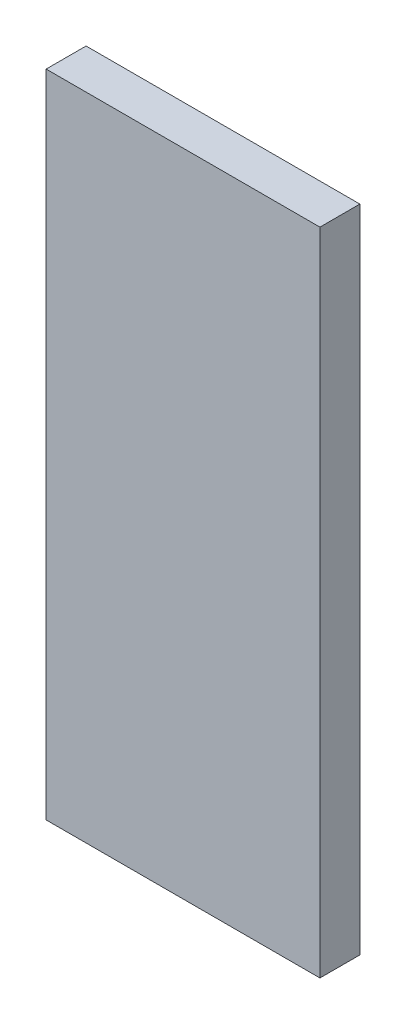
ISO-10303-21;
HEADER;
FILE_DESCRIPTION(('STEP AP214'),'2;1');
FILE_NAME('part.step','',(''),(''),'','','');
FILE_SCHEMA(('AUTOMOTIVE_DESIGN { 1 0 10303 214 1 1 1 1 }'));
ENDSEC;
DATA;
#1=APPLICATION_CONTEXT('core data for automotive mechanical design processes');
#2=APPLICATION_PROTOCOL_DEFINITION('international standard','automotive_design',2000,#1);
#3=PRODUCT_CONTEXT('',#1,'mechanical');
#4=PRODUCT('Part','Part','',(#3));
#5=PRODUCT_RELATED_PRODUCT_CATEGORY('part','',(#4));
#6=PRODUCT_DEFINITION_FORMATION('','',#4);
#7=PRODUCT_DEFINITION_CONTEXT('part definition',#1,'design');
#8=PRODUCT_DEFINITION('design','',#6,#7);
#9=PRODUCT_DEFINITION_SHAPE('','',#8);
#10=(LENGTH_UNIT() NAMED_UNIT(*) SI_UNIT(.MILLI.,.METRE.));
#11=(NAMED_UNIT(*) PLANE_ANGLE_UNIT() SI_UNIT($,.RADIAN.));
#12=(NAMED_UNIT(*) SI_UNIT($,.STERADIAN.) SOLID_ANGLE_UNIT());
#13=UNCERTAINTY_MEASURE_WITH_UNIT(LENGTH_MEASURE(1.E-05),#10,'distance_accuracy_value','');
#14=(GEOMETRIC_REPRESENTATION_CONTEXT(3) GLOBAL_UNCERTAINTY_ASSIGNED_CONTEXT((#13)) GLOBAL_UNIT_ASSIGNED_CONTEXT((#10,
#11,#12)) REPRESENTATION_CONTEXT('',''));
#15=CARTESIAN_POINT('',(0.,0.,0.));
#16=DIRECTION('',(0.,0.,1.));
#17=DIRECTION('',(1.,0.,0.));
#18=AXIS2_PLACEMENT_3D('',#15,#16,#17);
#19=CARTESIAN_POINT('',(2.39949228,-5.69949076,0.70000114));
#20=DIRECTION('',(0.,0.,1.));
#21=DIRECTION('',(1.,0.,0.));
#22=AXIS2_PLACEMENT_3D('',#19,#20,#21);
#23=PLANE('',#22);
#24=DIRECTION('',(0.,1.,0.));
#25=VECTOR('',#24,1.);
#26=CARTESIAN_POINT('',(-2.39949228,-5.69949076,0.70000114));
#27=LINE('',#26,#25);
#28=CARTESIAN_POINT('',(-2.39949228,-5.69949076,0.70000114));
#29=VERTEX_POINT('',#28);
#30=CARTESIAN_POINT('',(-2.39949228,5.69949076,0.70000114));
#31=VERTEX_POINT('',#30);
#32=EDGE_CURVE('E53',#29,#31,#27,.T.);
#33=ORIENTED_EDGE('',*,*,#32,.F.);
#34=DIRECTION('',(1.,0.,0.));
#35=VECTOR('',#34,1.);
#36=CARTESIAN_POINT('',(2.39949228,-5.69949076,0.70000114));
#37=LINE('',#36,#35);
#38=CARTESIAN_POINT('',(2.39949228,-5.69949076,0.70000114));
#39=VERTEX_POINT('',#38);
#40=EDGE_CURVE('E68',#39,#29,#37,.F.);
#41=ORIENTED_EDGE('',*,*,#40,.F.);
#42=DIRECTION('',(0.,1.,0.));
#43=VECTOR('',#42,1.);
#44=CARTESIAN_POINT('',(2.39949228,5.69949076,0.70000114));
#45=LINE('',#44,#43);
#46=CARTESIAN_POINT('',(2.39949228,5.69949076,0.70000114));
#47=VERTEX_POINT('',#46);
#48=EDGE_CURVE('E20',#47,#39,#45,.F.);
#49=ORIENTED_EDGE('',*,*,#48,.F.);
#50=DIRECTION('',(1.,0.,0.));
#51=VECTOR('',#50,1.);
#52=CARTESIAN_POINT('',(-2.39949228,5.69949076,0.70000114));
#53=LINE('',#52,#51);
#54=EDGE_CURVE('E58',#31,#47,#53,.T.);
#55=ORIENTED_EDGE('',*,*,#54,.F.);
#56=EDGE_LOOP('',(#33,#41,#49,#55));
#57=FACE_BOUND('',#56,.T.);
#58=ADVANCED_FACE('F17',(#57),#23,.T.);
#59=CARTESIAN_POINT('',(2.39949228,5.69949076,0.));
#60=DIRECTION('',(1.,0.,0.));
#61=DIRECTION('',(0.,0.,-1.));
#62=AXIS2_PLACEMENT_3D('',#59,#60,#61);
#63=PLANE('',#62);
#64=DIRECTION('',(0.,0.,-1.));
#65=VECTOR('',#64,1.);
#66=CARTESIAN_POINT('',(2.39949228,-5.69949076,0.));
#67=LINE('',#66,#65);
#68=CARTESIAN_POINT('',(2.39949228,-5.69949076,0.));
#69=VERTEX_POINT('',#68);
#70=EDGE_CURVE('E79',#69,#39,#67,.F.);
#71=ORIENTED_EDGE('',*,*,#70,.F.);
#72=DIRECTION('',(0.,1.,0.));
#73=VECTOR('',#72,1.);
#74=CARTESIAN_POINT('',(2.39949228,-5.69949076,0.));
#75=LINE('',#74,#73);
#76=CARTESIAN_POINT('',(2.39949228,5.69949076,0.));
#77=VERTEX_POINT('',#76);
#78=EDGE_CURVE('E74',#69,#77,#75,.T.);
#79=ORIENTED_EDGE('',*,*,#78,.T.);
#80=DIRECTION('',(0.,0.,1.));
#81=VECTOR('',#80,1.);
#82=CARTESIAN_POINT('',(2.39949228,5.69949076,0.));
#83=LINE('',#82,#81);
#84=EDGE_CURVE('E63',#47,#77,#83,.F.);
#85=ORIENTED_EDGE('',*,*,#84,.F.);
#86=ORIENTED_EDGE('',*,*,#48,.T.);
#87=EDGE_LOOP('',(#71,#79,#85,#86));
#88=FACE_BOUND('',#87,.T.);
#89=ADVANCED_FACE('F73',(#88),#63,.T.);
#90=CARTESIAN_POINT('',(-2.39949228,5.69949076,0.));
#91=DIRECTION('',(0.,1.,0.));
#92=DIRECTION('',(0.,0.,1.));
#93=AXIS2_PLACEMENT_3D('',#90,#91,#92);
#94=PLANE('',#93);
#95=ORIENTED_EDGE('',*,*,#84,.T.);
#96=DIRECTION('',(1.,0.,0.));
#97=VECTOR('',#96,1.);
#98=CARTESIAN_POINT('',(2.39949228,5.69949076,0.));
#99=LINE('',#98,#97);
#100=CARTESIAN_POINT('',(-2.39949228,5.69949076,0.));
#101=VERTEX_POINT('',#100);
#102=EDGE_CURVE('E84',#77,#101,#99,.F.);
#103=ORIENTED_EDGE('',*,*,#102,.T.);
#104=DIRECTION('',(0.,0.,1.));
#105=VECTOR('',#104,1.);
#106=CARTESIAN_POINT('',(-2.39949228,5.69949076,0.));
#107=LINE('',#106,#105);
#108=EDGE_CURVE('E65',#31,#101,#107,.F.);
#109=ORIENTED_EDGE('',*,*,#108,.F.);
#110=ORIENTED_EDGE('',*,*,#54,.T.);
#111=EDGE_LOOP('',(#95,#103,#109,#110));
#112=FACE_BOUND('',#111,.T.);
#113=ADVANCED_FACE('F60',(#112),#94,.T.);
#114=CARTESIAN_POINT('',(-2.39949228,-5.69949076,0.));
#115=DIRECTION('',(-1.,0.,0.));
#116=DIRECTION('',(0.,0.,1.));
#117=AXIS2_PLACEMENT_3D('',#114,#115,#116);
#118=PLANE('',#117);
#119=ORIENTED_EDGE('',*,*,#108,.T.);
#120=DIRECTION('',(0.,1.,0.));
#121=VECTOR('',#120,1.);
#122=CARTESIAN_POINT('',(-2.39949228,-5.69949076,0.));
#123=LINE('',#122,#121);
#124=CARTESIAN_POINT('',(-2.39949228,-5.69949076,0.));
#125=VERTEX_POINT('',#124);
#126=EDGE_CURVE('E26',#101,#125,#123,.F.);
#127=ORIENTED_EDGE('',*,*,#126,.T.);
#128=DIRECTION('',(0.,0.,-1.));
#129=VECTOR('',#128,1.);
#130=CARTESIAN_POINT('',(-2.39949228,-5.69949076,0.));
#131=LINE('',#130,#129);
#132=EDGE_CURVE('E34',#29,#125,#131,.T.);
#133=ORIENTED_EDGE('',*,*,#132,.F.);
#134=ORIENTED_EDGE('',*,*,#32,.T.);
#135=EDGE_LOOP('',(#119,#127,#133,#134));
#136=FACE_BOUND('',#135,.T.);
#137=ADVANCED_FACE('F88',(#136),#118,.T.);
#138=CARTESIAN_POINT('',(2.39949228,-5.69949076,0.));
#139=DIRECTION('',(0.,-1.,0.));
#140=DIRECTION('',(0.,0.,-1.));
#141=AXIS2_PLACEMENT_3D('',#138,#139,#140);
#142=PLANE('',#141);
#143=ORIENTED_EDGE('',*,*,#132,.T.);
#144=DIRECTION('',(1.,0.,0.));
#145=VECTOR('',#144,1.);
#146=CARTESIAN_POINT('',(2.39949228,-5.69949076,0.));
#147=LINE('',#146,#145);
#148=EDGE_CURVE('E11',#125,#69,#147,.T.);
#149=ORIENTED_EDGE('',*,*,#148,.T.);
#150=ORIENTED_EDGE('',*,*,#70,.T.);
#151=ORIENTED_EDGE('',*,*,#40,.T.);
#152=EDGE_LOOP('',(#143,#149,#150,#151));
#153=FACE_BOUND('',#152,.T.);
#154=ADVANCED_FACE('F91',(#153),#142,.T.);
#155=CARTESIAN_POINT('',(2.39949228,-5.69949076,0.));
#156=DIRECTION('',(0.,0.,1.));
#157=DIRECTION('',(1.,0.,0.));
#158=AXIS2_PLACEMENT_3D('',#155,#156,#157);
#159=PLANE('',#158);
#160=ORIENTED_EDGE('',*,*,#126,.F.);
#161=ORIENTED_EDGE('',*,*,#102,.F.);
#162=ORIENTED_EDGE('',*,*,#78,.F.);
#163=ORIENTED_EDGE('',*,*,#148,.F.);
#164=EDGE_LOOP('',(#160,#161,#162,#163));
#165=FACE_BOUND('',#164,.T.);
#166=ADVANCED_FACE('F90',(#165),#159,.F.);
#167=CLOSED_SHELL('',(#58,#89,#113,#137,#154,#166));
#168=MANIFOLD_SOLID_BREP('B1',#167);
#169=ADVANCED_BREP_SHAPE_REPRESENTATION('',(#18,#168),#14);
#170=SHAPE_DEFINITION_REPRESENTATION(#9,#169);
ENDSEC;
END-ISO-10303-21;
